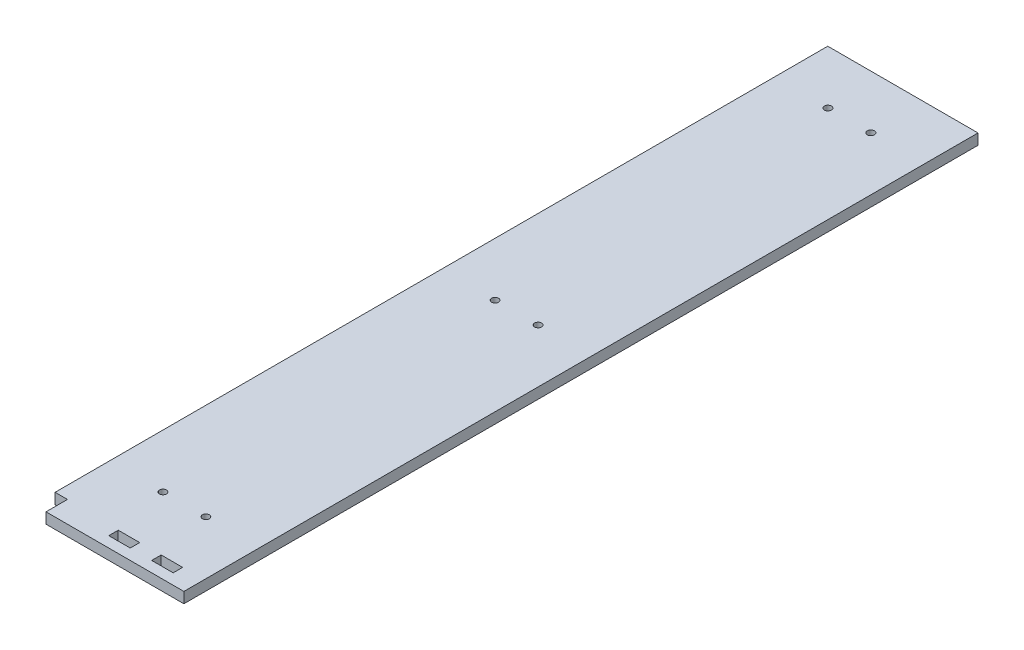
ISO-10303-21;
HEADER;
FILE_DESCRIPTION(('STEP AP214'),'2;1');
FILE_NAME('part.step','',(''),(''),'','','');
FILE_SCHEMA(('AUTOMOTIVE_DESIGN { 1 0 10303 214 1 1 1 1 }'));
ENDSEC;
DATA;
#1=APPLICATION_CONTEXT('core data for automotive mechanical design processes');
#2=APPLICATION_PROTOCOL_DEFINITION('international standard','automotive_design',2000,#1);
#3=PRODUCT_CONTEXT('',#1,'mechanical');
#4=PRODUCT('Part','Part','',(#3));
#5=PRODUCT_RELATED_PRODUCT_CATEGORY('part','',(#4));
#6=PRODUCT_DEFINITION_FORMATION('','',#4);
#7=PRODUCT_DEFINITION_CONTEXT('part definition',#1,'design');
#8=PRODUCT_DEFINITION('design','',#6,#7);
#9=PRODUCT_DEFINITION_SHAPE('','',#8);
#10=(LENGTH_UNIT() NAMED_UNIT(*) SI_UNIT(.MILLI.,.METRE.));
#11=(NAMED_UNIT(*) PLANE_ANGLE_UNIT() SI_UNIT($,.RADIAN.));
#12=(NAMED_UNIT(*) SI_UNIT($,.STERADIAN.) SOLID_ANGLE_UNIT());
#13=UNCERTAINTY_MEASURE_WITH_UNIT(LENGTH_MEASURE(1.E-05),#10,'distance_accuracy_value','');
#14=(GEOMETRIC_REPRESENTATION_CONTEXT(3) GLOBAL_UNCERTAINTY_ASSIGNED_CONTEXT((#13)) GLOBAL_UNIT_ASSIGNED_CONTEXT((#10,
#11,#12)) REPRESENTATION_CONTEXT('',''));
#15=CARTESIAN_POINT('',(0.,0.,0.));
#16=DIRECTION('',(0.,0.,1.));
#17=DIRECTION('',(1.,0.,0.));
#18=AXIS2_PLACEMENT_3D('',#15,#16,#17);
#19=CARTESIAN_POINT('',(0.,0.,0.));
#20=DIRECTION('',(0.,0.,-1.));
#21=DIRECTION('',(-1.,0.,0.));
#22=AXIS2_PLACEMENT_3D('',#19,#20,#21);
#23=PLANE('',#22);
#24=DIRECTION('',(0.,-1.,0.));
#25=VECTOR('',#24,1.);
#26=CARTESIAN_POINT('',(-37.1406515102137,-44.45,0.));
#27=LINE('',#26,#25);
#28=CARTESIAN_POINT('',(-37.1406515102137,-38.1,0.));
#29=VERTEX_POINT('',#28);
#30=CARTESIAN_POINT('',(-37.1406515102137,-44.45,0.));
#31=VERTEX_POINT('',#30);
#32=EDGE_CURVE('E199',#29,#31,#27,.T.);
#33=ORIENTED_EDGE('',*,*,#32,.F.);
#34=DIRECTION('',(-1.,0.,0.));
#35=VECTOR('',#34,1.);
#36=CARTESIAN_POINT('',(44.45,-38.1,0.));
#37=LINE('',#36,#35);
#38=CARTESIAN_POINT('',(-44.45,-38.1,0.));
#39=VERTEX_POINT('',#38);
#40=EDGE_CURVE('E264',#29,#39,#37,.T.);
#41=ORIENTED_EDGE('',*,*,#40,.T.);
#42=DIRECTION('',(0.,-1.,0.));
#43=VECTOR('',#42,1.);
#44=CARTESIAN_POINT('',(-44.45,-38.1,0.));
#45=LINE('',#44,#43);
#46=CARTESIAN_POINT('',(-44.45,-44.45,0.));
#47=VERTEX_POINT('',#46);
#48=EDGE_CURVE('E268',#39,#47,#45,.T.);
#49=ORIENTED_EDGE('',*,*,#48,.T.);
#50=DIRECTION('',(1.,0.,0.));
#51=VECTOR('',#50,1.);
#52=CARTESIAN_POINT('',(44.45,-44.45,0.));
#53=LINE('',#52,#51);
#54=EDGE_CURVE('E219',#47,#31,#53,.T.);
#55=ORIENTED_EDGE('',*,*,#54,.T.);
#56=EDGE_LOOP('',(#33,#41,#49,#55));
#57=FACE_BOUND('',#56,.T.);
#58=ADVANCED_FACE('F33',(#57),#23,.F.);
#59=CARTESIAN_POINT('',(0.,0.,-457.2));
#60=DIRECTION('',(0.,0.,-1.));
#61=DIRECTION('',(-1.,0.,0.));
#62=AXIS2_PLACEMENT_3D('',#59,#60,#61);
#63=PLANE('',#62);
#64=DIRECTION('',(0.,1.,0.));
#65=VECTOR('',#64,1.);
#66=CARTESIAN_POINT('',(44.45,-38.1,-457.2));
#67=LINE('',#66,#65);
#68=CARTESIAN_POINT('',(44.45,-44.45,-457.2));
#69=VERTEX_POINT('',#68);
#70=CARTESIAN_POINT('',(44.45,-38.1,-457.2));
#71=VERTEX_POINT('',#70);
#72=EDGE_CURVE('E42',#69,#71,#67,.T.);
#73=ORIENTED_EDGE('',*,*,#72,.F.);
#74=DIRECTION('',(1.,0.,0.));
#75=VECTOR('',#74,1.);
#76=CARTESIAN_POINT('',(44.45,-44.45,-457.2));
#77=LINE('',#76,#75);
#78=CARTESIAN_POINT('',(-44.45,-44.45,-457.2));
#79=VERTEX_POINT('',#78);
#80=EDGE_CURVE('E282',#79,#69,#77,.T.);
#81=ORIENTED_EDGE('',*,*,#80,.F.);
#82=DIRECTION('',(0.,-1.,0.));
#83=VECTOR('',#82,1.);
#84=CARTESIAN_POINT('',(-44.45,-38.1,-457.2));
#85=LINE('',#84,#83);
#86=CARTESIAN_POINT('',(-44.45,-38.1,-457.2));
#87=VERTEX_POINT('',#86);
#88=EDGE_CURVE('E279',#87,#79,#85,.T.);
#89=ORIENTED_EDGE('',*,*,#88,.F.);
#90=DIRECTION('',(-1.,0.,0.));
#91=VECTOR('',#90,1.);
#92=CARTESIAN_POINT('',(44.45,-38.1,-457.2));
#93=LINE('',#92,#91);
#94=EDGE_CURVE('E273',#71,#87,#93,.T.);
#95=ORIENTED_EDGE('',*,*,#94,.F.);
#96=EDGE_LOOP('',(#73,#81,#89,#95));
#97=FACE_BOUND('',#96,.T.);
#98=ADVANCED_FACE('F35',(#97),#63,.T.);
#99=CARTESIAN_POINT('',(44.45,-38.1,-546.326497182376));
#100=DIRECTION('',(0.,1.,0.));
#101=DIRECTION('',(-1.,0.,0.));
#102=AXIS2_PLACEMENT_3D('',#99,#100,#101);
#103=PLANE('',#102);
#104=DIRECTION('',(0.,0.,-1.));
#105=VECTOR('',#104,1.);
#106=CARTESIAN_POINT('',(6.35000000000004,-38.1,-546.326497182376));
#107=LINE('',#106,#105);
#108=CARTESIAN_POINT('',(6.35000000000004,-38.1,6.35000000000002));
#109=VERTEX_POINT('',#108);
#110=CARTESIAN_POINT('',(6.35000000000004,-38.1,0.743350670350194));
#111=VERTEX_POINT('',#110);
#112=EDGE_CURVE('E168',#109,#111,#107,.T.);
#113=ORIENTED_EDGE('',*,*,#112,.F.);
#114=DIRECTION('',(1.,0.,0.));
#115=VECTOR('',#114,1.);
#116=CARTESIAN_POINT('',(44.45,-38.1,6.34999999999997));
#117=LINE('',#116,#115);
#118=CARTESIAN_POINT('',(-6.34999999999997,-38.1,6.34999999999996));
#119=VERTEX_POINT('',#118);
#120=EDGE_CURVE('E161',#119,#109,#117,.T.);
#121=ORIENTED_EDGE('',*,*,#120,.F.);
#122=DIRECTION('',(0.,0.,1.));
#123=VECTOR('',#122,1.);
#124=CARTESIAN_POINT('',(-6.34999999999997,-38.1,-546.326497182376));
#125=LINE('',#124,#123);
#126=CARTESIAN_POINT('',(-6.34999999999996,-38.1,0.743350670350193));
#127=VERTEX_POINT('',#126);
#128=EDGE_CURVE('E141',#127,#119,#125,.T.);
#129=ORIENTED_EDGE('',*,*,#128,.F.);
#130=DIRECTION('',(-1.,0.,0.));
#131=VECTOR('',#130,1.);
#132=CARTESIAN_POINT('',(44.45,-38.1,0.74335067035014));
#133=LINE('',#132,#131);
#134=EDGE_CURVE('E166',#111,#127,#133,.T.);
#135=ORIENTED_EDGE('',*,*,#134,.F.);
#136=EDGE_LOOP('',(#113,#121,#129,#135));
#137=FACE_BOUND('',#136,.T.);
#138=DIRECTION('',(0.,0.,-1.));
#139=VECTOR('',#138,1.);
#140=CARTESIAN_POINT('',(31.75,-38.1,-546.326497182376));
#141=LINE('',#140,#139);
#142=CARTESIAN_POINT('',(31.75,-38.1,6.35000000000002));
#143=VERTEX_POINT('',#142);
#144=CARTESIAN_POINT('',(31.75,-38.1,0.743350670350198));
#145=VERTEX_POINT('',#144);
#146=EDGE_CURVE('E197',#143,#145,#141,.T.);
#147=ORIENTED_EDGE('',*,*,#146,.F.);
#148=DIRECTION('',(1.,0.,0.));
#149=VECTOR('',#148,1.);
#150=CARTESIAN_POINT('',(44.45,-38.1,6.35000000000008));
#151=LINE('',#150,#149);
#152=CARTESIAN_POINT('',(19.05,-38.1,6.35000000000008));
#153=VERTEX_POINT('',#152);
#154=EDGE_CURVE('E184',#153,#143,#151,.T.);
#155=ORIENTED_EDGE('',*,*,#154,.F.);
#156=DIRECTION('',(0.,0.,1.));
#157=VECTOR('',#156,1.);
#158=CARTESIAN_POINT('',(19.05,-38.1,-546.326497182376));
#159=LINE('',#158,#157);
#160=CARTESIAN_POINT('',(19.05,-38.1,0.743350670350197));
#161=VERTEX_POINT('',#160);
#162=EDGE_CURVE('E192',#161,#153,#159,.T.);
#163=ORIENTED_EDGE('',*,*,#162,.F.);
#164=DIRECTION('',(-1.,0.,0.));
#165=VECTOR('',#164,1.);
#166=CARTESIAN_POINT('',(44.45,-38.1,0.743350670350251));
#167=LINE('',#166,#165);
#168=EDGE_CURVE('E195',#145,#161,#167,.T.);
#169=ORIENTED_EDGE('',*,*,#168,.F.);
#170=EDGE_LOOP('',(#147,#155,#163,#169));
#171=FACE_BOUND('',#170,.T.);
#172=CARTESIAN_POINT('',(12.7,-38.1,-425.5516));
#173=DIRECTION('',(0.,-1.,0.));
#174=DIRECTION('',(1.,0.,0.));
#175=AXIS2_PLACEMENT_3D('',#172,#173,#174);
#176=CIRCLE('',#175,2.09549999999999);
#177=CARTESIAN_POINT('',(14.7954999999999,-38.1,-425.5516));
#178=VERTEX_POINT('',#177);
#179=EDGE_CURVE('E213',#178,#178,#176,.T.);
#180=ORIENTED_EDGE('',*,*,#179,.T.);
#181=EDGE_LOOP('',(#180));
#182=FACE_BOUND('',#181,.T.);
#183=CARTESIAN_POINT('',(-12.7000000000001,-38.1,-425.5516));
#184=DIRECTION('',(0.,-1.,0.));
#185=DIRECTION('',(1.,0.,0.));
#186=AXIS2_PLACEMENT_3D('',#183,#184,#185);
#187=CIRCLE('',#186,2.09549999999998);
#188=CARTESIAN_POINT('',(-10.6045000000001,-38.1,-425.5516));
#189=VERTEX_POINT('',#188);
#190=EDGE_CURVE('E237',#189,#189,#187,.T.);
#191=ORIENTED_EDGE('',*,*,#190,.T.);
#192=EDGE_LOOP('',(#191));
#193=FACE_BOUND('',#192,.T.);
#194=CARTESIAN_POINT('',(12.7,-38.1,-32.0675));
#195=DIRECTION('',(0.,-1.,0.));
#196=DIRECTION('',(1.,0.,0.));
#197=AXIS2_PLACEMENT_3D('',#194,#195,#196);
#198=CIRCLE('',#197,2.06375);
#199=CARTESIAN_POINT('',(14.76375,-38.1,-32.0675));
#200=VERTEX_POINT('',#199);
#201=EDGE_CURVE('E243',#200,#200,#198,.T.);
#202=ORIENTED_EDGE('',*,*,#201,.T.);
#203=EDGE_LOOP('',(#202));
#204=FACE_BOUND('',#203,.T.);
#205=CARTESIAN_POINT('',(-12.7,-38.1,-32.0675));
#206=DIRECTION('',(0.,-1.,0.));
#207=DIRECTION('',(1.,0.,0.));
#208=AXIS2_PLACEMENT_3D('',#205,#206,#207);
#209=CIRCLE('',#208,2.06375);
#210=CARTESIAN_POINT('',(-10.63625,-38.1,-32.0675));
#211=VERTEX_POINT('',#210);
#212=EDGE_CURVE('E249',#211,#211,#209,.T.);
#213=ORIENTED_EDGE('',*,*,#212,.T.);
#214=EDGE_LOOP('',(#213));
#215=FACE_BOUND('',#214,.T.);
#216=CARTESIAN_POINT('',(12.7,-38.1,-228.6));
#217=DIRECTION('',(0.,-1.,0.));
#218=DIRECTION('',(1.,0.,0.));
#219=AXIS2_PLACEMENT_3D('',#216,#217,#218);
#220=CIRCLE('',#219,2.06375);
#221=CARTESIAN_POINT('',(14.76375,-38.1,-228.6));
#222=VERTEX_POINT('',#221);
#223=EDGE_CURVE('E255',#222,#222,#220,.T.);
#224=ORIENTED_EDGE('',*,*,#223,.T.);
#225=EDGE_LOOP('',(#224));
#226=FACE_BOUND('',#225,.T.);
#227=CARTESIAN_POINT('',(-12.7,-38.1,-228.6));
#228=DIRECTION('',(0.,-1.,0.));
#229=DIRECTION('',(1.,0.,0.));
#230=AXIS2_PLACEMENT_3D('',#227,#228,#229);
#231=CIRCLE('',#230,2.06375);
#232=CARTESIAN_POINT('',(-10.63625,-38.1,-228.6));
#233=VERTEX_POINT('',#232);
#234=EDGE_CURVE('E261',#233,#233,#231,.T.);
#235=ORIENTED_EDGE('',*,*,#234,.T.);
#236=EDGE_LOOP('',(#235));
#237=FACE_BOUND('',#236,.T.);
#238=DIRECTION('',(0.,0.,1.));
#239=VECTOR('',#238,1.);
#240=CARTESIAN_POINT('',(44.45,-38.1,-546.326497182376));
#241=LINE('',#240,#239);
#242=CARTESIAN_POINT('',(44.45,-38.1,12.7));
#243=VERTEX_POINT('',#242);
#244=EDGE_CURVE('E11',#71,#243,#241,.T.);
#245=ORIENTED_EDGE('',*,*,#244,.F.);
#246=ORIENTED_EDGE('',*,*,#94,.T.);
#247=DIRECTION('',(0.,0.,1.));
#248=VECTOR('',#247,1.);
#249=CARTESIAN_POINT('',(-44.45,-38.1,-546.326497182376));
#250=LINE('',#249,#248);
#251=EDGE_CURVE('E276',#87,#39,#250,.T.);
#252=ORIENTED_EDGE('',*,*,#251,.T.);
#253=ORIENTED_EDGE('',*,*,#40,.F.);
#254=DIRECTION('',(0.,0.,-1.));
#255=VECTOR('',#254,1.);
#256=CARTESIAN_POINT('',(-37.1406515102137,-38.1,12.7));
#257=LINE('',#256,#255);
#258=CARTESIAN_POINT('',(-37.1406515102137,-38.1,12.7));
#259=VERTEX_POINT('',#258);
#260=EDGE_CURVE('E224',#259,#29,#257,.T.);
#261=ORIENTED_EDGE('',*,*,#260,.F.);
#262=DIRECTION('',(-1.,0.,0.));
#263=VECTOR('',#262,1.);
#264=CARTESIAN_POINT('',(44.45,-38.1,12.7));
#265=LINE('',#264,#263);
#266=EDGE_CURVE('E203',#243,#259,#265,.T.);
#267=ORIENTED_EDGE('',*,*,#266,.F.);
#268=EDGE_LOOP('',(#245,#246,#252,#253,#261,#267));
#269=FACE_BOUND('',#268,.T.);
#270=ADVANCED_FACE('F298',(#137,#171,#182,#193,#204,#215,#226,#237,#269),#103,.T.);
#271=CARTESIAN_POINT('',(-44.45,-38.1,-546.326497182376));
#272=DIRECTION('',(-1.,0.,0.));
#273=DIRECTION('',(0.,0.,1.));
#274=AXIS2_PLACEMENT_3D('',#271,#272,#273);
#275=PLANE('',#274);
#276=ORIENTED_EDGE('',*,*,#251,.F.);
#277=ORIENTED_EDGE('',*,*,#88,.T.);
#278=DIRECTION('',(0.,0.,1.));
#279=VECTOR('',#278,1.);
#280=CARTESIAN_POINT('',(-44.45,-44.45,-546.326497182376));
#281=LINE('',#280,#279);
#282=EDGE_CURVE('E280',#79,#47,#281,.T.);
#283=ORIENTED_EDGE('',*,*,#282,.T.);
#284=ORIENTED_EDGE('',*,*,#48,.F.);
#285=EDGE_LOOP('',(#276,#277,#283,#284));
#286=FACE_BOUND('',#285,.T.);
#287=ADVANCED_FACE('F310',(#286),#275,.T.);
#288=CARTESIAN_POINT('',(44.45,-44.45,-546.326497182376));
#289=DIRECTION('',(0.,-1.,0.));
#290=DIRECTION('',(1.,0.,0.));
#291=AXIS2_PLACEMENT_3D('',#288,#289,#290);
#292=PLANE('',#291);
#293=DIRECTION('',(0.,0.,1.));
#294=VECTOR('',#293,1.);
#295=CARTESIAN_POINT('',(6.35000000000004,-44.45,0.743350670350194));
#296=LINE('',#295,#294);
#297=CARTESIAN_POINT('',(6.35000000000004,-44.45,0.743350670350194));
#298=VERTEX_POINT('',#297);
#299=CARTESIAN_POINT('',(6.35000000000004,-44.45,6.34999999999996));
#300=VERTEX_POINT('',#299);
#301=EDGE_CURVE('E58',#298,#300,#296,.T.);
#302=ORIENTED_EDGE('',*,*,#301,.F.);
#303=DIRECTION('',(1.,0.,0.));
#304=VECTOR('',#303,1.);
#305=CARTESIAN_POINT('',(6.35000000000004,-44.45,0.743350670350194));
#306=LINE('',#305,#304);
#307=CARTESIAN_POINT('',(-6.34999999999996,-44.45,0.743350670350193));
#308=VERTEX_POINT('',#307);
#309=EDGE_CURVE('E154',#308,#298,#306,.T.);
#310=ORIENTED_EDGE('',*,*,#309,.F.);
#311=DIRECTION('',(0.,0.,-1.));
#312=VECTOR('',#311,1.);
#313=CARTESIAN_POINT('',(-6.34999999999996,-44.45,0.743350670350193));
#314=LINE('',#313,#312);
#315=CARTESIAN_POINT('',(-6.34999999999996,-44.45,6.35000000000002));
#316=VERTEX_POINT('',#315);
#317=EDGE_CURVE('E138',#316,#308,#314,.T.);
#318=ORIENTED_EDGE('',*,*,#317,.F.);
#319=DIRECTION('',(-1.,0.,0.));
#320=VECTOR('',#319,1.);
#321=CARTESIAN_POINT('',(6.35000000000004,-44.45,6.35000000000002));
#322=LINE('',#321,#320);
#323=EDGE_CURVE('E147',#300,#316,#322,.T.);
#324=ORIENTED_EDGE('',*,*,#323,.F.);
#325=EDGE_LOOP('',(#302,#310,#318,#324));
#326=FACE_BOUND('',#325,.T.);
#327=DIRECTION('',(0.,0.,1.));
#328=VECTOR('',#327,1.);
#329=CARTESIAN_POINT('',(31.75,-44.45,0.743350670350198));
#330=LINE('',#329,#328);
#331=CARTESIAN_POINT('',(31.75,-44.45,0.743350670350198));
#332=VERTEX_POINT('',#331);
#333=CARTESIAN_POINT('',(31.75,-44.45,6.35000000000008));
#334=VERTEX_POINT('',#333);
#335=EDGE_CURVE('E170',#332,#334,#330,.T.);
#336=ORIENTED_EDGE('',*,*,#335,.F.);
#337=DIRECTION('',(1.,0.,0.));
#338=VECTOR('',#337,1.);
#339=CARTESIAN_POINT('',(31.75,-44.45,0.743350670350198));
#340=LINE('',#339,#338);
#341=CARTESIAN_POINT('',(19.05,-44.45,0.743350670350197));
#342=VERTEX_POINT('',#341);
#343=EDGE_CURVE('E178',#342,#332,#340,.T.);
#344=ORIENTED_EDGE('',*,*,#343,.F.);
#345=DIRECTION('',(0.,0.,-1.));
#346=VECTOR('',#345,1.);
#347=CARTESIAN_POINT('',(19.05,-44.45,0.743350670350197));
#348=LINE('',#347,#346);
#349=CARTESIAN_POINT('',(19.05,-44.45,6.35000000000002));
#350=VERTEX_POINT('',#349);
#351=EDGE_CURVE('E175',#350,#342,#348,.T.);
#352=ORIENTED_EDGE('',*,*,#351,.F.);
#353=DIRECTION('',(-1.,0.,0.));
#354=VECTOR('',#353,1.);
#355=CARTESIAN_POINT('',(31.75,-44.45,6.35000000000002));
#356=LINE('',#355,#354);
#357=EDGE_CURVE('E172',#334,#350,#356,.T.);
#358=ORIENTED_EDGE('',*,*,#357,.F.);
#359=EDGE_LOOP('',(#336,#344,#352,#358));
#360=FACE_BOUND('',#359,.T.);
#361=CARTESIAN_POINT('',(12.7,-44.45,-425.5516));
#362=DIRECTION('',(0.,-1.,0.));
#363=DIRECTION('',(1.,0.,0.));
#364=AXIS2_PLACEMENT_3D('',#361,#362,#363);
#365=CIRCLE('',#364,2.09549999999999);
#366=CARTESIAN_POINT('',(14.7954999999999,-44.45,-425.5516));
#367=VERTEX_POINT('',#366);
#368=EDGE_CURVE('E227',#367,#367,#365,.T.);
#369=ORIENTED_EDGE('',*,*,#368,.F.);
#370=EDGE_LOOP('',(#369));
#371=FACE_BOUND('',#370,.T.);
#372=CARTESIAN_POINT('',(-12.7000000000001,-44.45,-425.5516));
#373=DIRECTION('',(0.,-1.,0.));
#374=DIRECTION('',(1.,0.,0.));
#375=AXIS2_PLACEMENT_3D('',#372,#373,#374);
#376=CIRCLE('',#375,2.09549999999998);
#377=CARTESIAN_POINT('',(-10.6045000000001,-44.45,-425.5516));
#378=VERTEX_POINT('',#377);
#379=EDGE_CURVE('E235',#378,#378,#376,.T.);
#380=ORIENTED_EDGE('',*,*,#379,.F.);
#381=EDGE_LOOP('',(#380));
#382=FACE_BOUND('',#381,.T.);
#383=CARTESIAN_POINT('',(12.7,-44.45,-32.0675));
#384=DIRECTION('',(0.,-1.,0.));
#385=DIRECTION('',(1.,0.,0.));
#386=AXIS2_PLACEMENT_3D('',#383,#384,#385);
#387=CIRCLE('',#386,2.06375);
#388=CARTESIAN_POINT('',(14.76375,-44.45,-32.0675));
#389=VERTEX_POINT('',#388);
#390=EDGE_CURVE('E240',#389,#389,#387,.T.);
#391=ORIENTED_EDGE('',*,*,#390,.F.);
#392=EDGE_LOOP('',(#391));
#393=FACE_BOUND('',#392,.T.);
#394=CARTESIAN_POINT('',(-12.7,-44.45,-32.0675));
#395=DIRECTION('',(0.,-1.,0.));
#396=DIRECTION('',(1.,0.,0.));
#397=AXIS2_PLACEMENT_3D('',#394,#395,#396);
#398=CIRCLE('',#397,2.06375);
#399=CARTESIAN_POINT('',(-10.63625,-44.45,-32.0675));
#400=VERTEX_POINT('',#399);
#401=EDGE_CURVE('E246',#400,#400,#398,.T.);
#402=ORIENTED_EDGE('',*,*,#401,.F.);
#403=EDGE_LOOP('',(#402));
#404=FACE_BOUND('',#403,.T.);
#405=CARTESIAN_POINT('',(12.7,-44.45,-228.6));
#406=DIRECTION('',(0.,-1.,0.));
#407=DIRECTION('',(1.,0.,0.));
#408=AXIS2_PLACEMENT_3D('',#405,#406,#407);
#409=CIRCLE('',#408,2.06375);
#410=CARTESIAN_POINT('',(14.76375,-44.45,-228.6));
#411=VERTEX_POINT('',#410);
#412=EDGE_CURVE('E252',#411,#411,#409,.T.);
#413=ORIENTED_EDGE('',*,*,#412,.F.);
#414=EDGE_LOOP('',(#413));
#415=FACE_BOUND('',#414,.T.);
#416=CARTESIAN_POINT('',(-12.7,-44.45,-228.6));
#417=DIRECTION('',(0.,-1.,0.));
#418=DIRECTION('',(1.,0.,0.));
#419=AXIS2_PLACEMENT_3D('',#416,#417,#418);
#420=CIRCLE('',#419,2.06375);
#421=CARTESIAN_POINT('',(-10.63625,-44.45,-228.6));
#422=VERTEX_POINT('',#421);
#423=EDGE_CURVE('E258',#422,#422,#420,.T.);
#424=ORIENTED_EDGE('',*,*,#423,.F.);
#425=EDGE_LOOP('',(#424));
#426=FACE_BOUND('',#425,.T.);
#427=ORIENTED_EDGE('',*,*,#282,.F.);
#428=ORIENTED_EDGE('',*,*,#80,.T.);
#429=DIRECTION('',(0.,0.,1.));
#430=VECTOR('',#429,1.);
#431=CARTESIAN_POINT('',(44.45,-44.45,-546.326497182376));
#432=LINE('',#431,#430);
#433=CARTESIAN_POINT('',(44.45,-44.45,12.7));
#434=VERTEX_POINT('',#433);
#435=EDGE_CURVE('E283',#69,#434,#432,.T.);
#436=ORIENTED_EDGE('',*,*,#435,.T.);
#437=DIRECTION('',(1.,0.,0.));
#438=VECTOR('',#437,1.);
#439=CARTESIAN_POINT('',(44.45,-44.45,12.7));
#440=LINE('',#439,#438);
#441=CARTESIAN_POINT('',(-37.1406515102137,-44.45,12.7));
#442=VERTEX_POINT('',#441);
#443=EDGE_CURVE('E207',#442,#434,#440,.T.);
#444=ORIENTED_EDGE('',*,*,#443,.F.);
#445=DIRECTION('',(0.,0.,-1.));
#446=VECTOR('',#445,1.);
#447=CARTESIAN_POINT('',(-37.1406515102137,-44.45,12.7));
#448=LINE('',#447,#446);
#449=EDGE_CURVE('E210',#442,#31,#448,.T.);
#450=ORIENTED_EDGE('',*,*,#449,.T.);
#451=ORIENTED_EDGE('',*,*,#54,.F.);
#452=EDGE_LOOP('',(#427,#428,#436,#444,#450,#451));
#453=FACE_BOUND('',#452,.T.);
#454=ADVANCED_FACE('F151',(#326,#360,#371,#382,#393,#404,#415,#426,#453),#292,.T.);
#455=CARTESIAN_POINT('',(44.45,-38.1,-546.326497182376));
#456=DIRECTION('',(1.,0.,0.));
#457=DIRECTION('',(0.,0.,-1.));
#458=AXIS2_PLACEMENT_3D('',#455,#456,#457);
#459=PLANE('',#458);
#460=ORIENTED_EDGE('',*,*,#435,.F.);
#461=ORIENTED_EDGE('',*,*,#72,.T.);
#462=ORIENTED_EDGE('',*,*,#244,.T.);
#463=DIRECTION('',(0.,1.,0.));
#464=VECTOR('',#463,1.);
#465=CARTESIAN_POINT('',(44.45,-44.45,12.7));
#466=LINE('',#465,#464);
#467=EDGE_CURVE('E200',#434,#243,#466,.T.);
#468=ORIENTED_EDGE('',*,*,#467,.F.);
#469=EDGE_LOOP('',(#460,#461,#462,#468));
#470=FACE_BOUND('',#469,.T.);
#471=ADVANCED_FACE('F292',(#470),#459,.T.);
#472=CARTESIAN_POINT('',(-12.7,-38.1,-228.6));
#473=DIRECTION('',(0.,-1.,0.));
#474=DIRECTION('',(1.,0.,0.));
#475=AXIS2_PLACEMENT_3D('',#472,#473,#474);
#476=CYLINDRICAL_SURFACE('',#475,2.06375);
#477=ORIENTED_EDGE('',*,*,#234,.F.);
#478=EDGE_LOOP('',(#477));
#479=FACE_BOUND('',#478,.T.);
#480=ORIENTED_EDGE('',*,*,#423,.T.);
#481=EDGE_LOOP('',(#480));
#482=FACE_BOUND('',#481,.T.);
#483=ADVANCED_FACE('F332',(#479,#482),#476,.F.);
#484=CARTESIAN_POINT('',(12.7,-38.1,-228.6));
#485=DIRECTION('',(0.,-1.,0.));
#486=DIRECTION('',(1.,0.,0.));
#487=AXIS2_PLACEMENT_3D('',#484,#485,#486);
#488=CYLINDRICAL_SURFACE('',#487,2.06375);
#489=ORIENTED_EDGE('',*,*,#223,.F.);
#490=EDGE_LOOP('',(#489));
#491=FACE_BOUND('',#490,.T.);
#492=ORIENTED_EDGE('',*,*,#412,.T.);
#493=EDGE_LOOP('',(#492));
#494=FACE_BOUND('',#493,.T.);
#495=ADVANCED_FACE('F364',(#491,#494),#488,.F.);
#496=CARTESIAN_POINT('',(-12.7,-38.1,-32.0675));
#497=DIRECTION('',(0.,-1.,0.));
#498=DIRECTION('',(1.,0.,0.));
#499=AXIS2_PLACEMENT_3D('',#496,#497,#498);
#500=CYLINDRICAL_SURFACE('',#499,2.06375);
#501=ORIENTED_EDGE('',*,*,#212,.F.);
#502=EDGE_LOOP('',(#501));
#503=FACE_BOUND('',#502,.T.);
#504=ORIENTED_EDGE('',*,*,#401,.T.);
#505=EDGE_LOOP('',(#504));
#506=FACE_BOUND('',#505,.T.);
#507=ADVANCED_FACE('F370',(#503,#506),#500,.F.);
#508=CARTESIAN_POINT('',(12.7,-38.1,-32.0675));
#509=DIRECTION('',(0.,-1.,0.));
#510=DIRECTION('',(1.,0.,0.));
#511=AXIS2_PLACEMENT_3D('',#508,#509,#510);
#512=CYLINDRICAL_SURFACE('',#511,2.06375);
#513=ORIENTED_EDGE('',*,*,#201,.F.);
#514=EDGE_LOOP('',(#513));
#515=FACE_BOUND('',#514,.T.);
#516=ORIENTED_EDGE('',*,*,#390,.T.);
#517=EDGE_LOOP('',(#516));
#518=FACE_BOUND('',#517,.T.);
#519=ADVANCED_FACE('F375',(#515,#518),#512,.F.);
#520=CARTESIAN_POINT('',(-12.7000000000001,-38.1,-425.5516));
#521=DIRECTION('',(0.,-1.,0.));
#522=DIRECTION('',(1.,0.,0.));
#523=AXIS2_PLACEMENT_3D('',#520,#521,#522);
#524=CYLINDRICAL_SURFACE('',#523,2.09549999999998);
#525=ORIENTED_EDGE('',*,*,#190,.F.);
#526=EDGE_LOOP('',(#525));
#527=FACE_BOUND('',#526,.T.);
#528=ORIENTED_EDGE('',*,*,#379,.T.);
#529=EDGE_LOOP('',(#528));
#530=FACE_BOUND('',#529,.T.);
#531=ADVANCED_FACE('F322',(#527,#530),#524,.F.);
#532=CARTESIAN_POINT('',(12.7,-38.1,-425.5516));
#533=DIRECTION('',(0.,-1.,0.));
#534=DIRECTION('',(1.,0.,0.));
#535=AXIS2_PLACEMENT_3D('',#532,#533,#534);
#536=CYLINDRICAL_SURFACE('',#535,2.09549999999999);
#537=ORIENTED_EDGE('',*,*,#179,.F.);
#538=EDGE_LOOP('',(#537));
#539=FACE_BOUND('',#538,.T.);
#540=ORIENTED_EDGE('',*,*,#368,.T.);
#541=EDGE_LOOP('',(#540));
#542=FACE_BOUND('',#541,.T.);
#543=ADVANCED_FACE('F314',(#539,#542),#536,.F.);
#544=CARTESIAN_POINT('',(-37.1406515102137,-44.45,12.7));
#545=DIRECTION('',(1.,0.,0.));
#546=DIRECTION('',(0.,0.,-1.));
#547=AXIS2_PLACEMENT_3D('',#544,#545,#546);
#548=PLANE('',#547);
#549=ORIENTED_EDGE('',*,*,#32,.T.);
#550=ORIENTED_EDGE('',*,*,#449,.F.);
#551=DIRECTION('',(0.,-1.,0.));
#552=VECTOR('',#551,1.);
#553=CARTESIAN_POINT('',(-37.1406515102137,-44.45,12.7));
#554=LINE('',#553,#552);
#555=EDGE_CURVE('E205',#259,#442,#554,.T.);
#556=ORIENTED_EDGE('',*,*,#555,.F.);
#557=ORIENTED_EDGE('',*,*,#260,.T.);
#558=EDGE_LOOP('',(#549,#550,#556,#557));
#559=FACE_BOUND('',#558,.T.);
#560=ADVANCED_FACE('F312',(#559),#548,.F.);
#561=CARTESIAN_POINT('',(0.,0.,12.7));
#562=DIRECTION('',(0.,0.,1.));
#563=DIRECTION('',(1.,0.,0.));
#564=AXIS2_PLACEMENT_3D('',#561,#562,#563);
#565=PLANE('',#564);
#566=ORIENTED_EDGE('',*,*,#467,.T.);
#567=ORIENTED_EDGE('',*,*,#266,.T.);
#568=ORIENTED_EDGE('',*,*,#555,.T.);
#569=ORIENTED_EDGE('',*,*,#443,.T.);
#570=EDGE_LOOP('',(#566,#567,#568,#569));
#571=FACE_BOUND('',#570,.T.);
#572=ADVANCED_FACE('F301',(#571),#565,.T.);
#573=CARTESIAN_POINT('',(31.75,-31.75,0.743350670350198));
#574=DIRECTION('',(1.,0.,0.));
#575=DIRECTION('',(0.,1.,0.));
#576=AXIS2_PLACEMENT_3D('',#573,#574,#575);
#577=PLANE('',#576);
#578=ORIENTED_EDGE('',*,*,#146,.T.);
#579=DIRECTION('',(0.,-1.,0.));
#580=VECTOR('',#579,1.);
#581=CARTESIAN_POINT('',(31.75,-31.75,0.743350670350198));
#582=LINE('',#581,#580);
#583=EDGE_CURVE('E182',#145,#332,#582,.T.);
#584=ORIENTED_EDGE('',*,*,#583,.T.);
#585=ORIENTED_EDGE('',*,*,#335,.T.);
#586=DIRECTION('',(0.,-1.,0.));
#587=VECTOR('',#586,1.);
#588=CARTESIAN_POINT('',(31.75,-31.75,6.35000000000002));
#589=LINE('',#588,#587);
#590=EDGE_CURVE('E181',#143,#334,#589,.T.);
#591=ORIENTED_EDGE('',*,*,#590,.F.);
#592=EDGE_LOOP('',(#578,#584,#585,#591));
#593=FACE_BOUND('',#592,.T.);
#594=ADVANCED_FACE('F320',(#593),#577,.F.);
#595=CARTESIAN_POINT('',(31.75,-31.75,0.743350670350198));
#596=DIRECTION('',(0.,0.,-1.));
#597=DIRECTION('',(-1.,0.,0.));
#598=AXIS2_PLACEMENT_3D('',#595,#596,#597);
#599=PLANE('',#598);
#600=ORIENTED_EDGE('',*,*,#168,.T.);
#601=DIRECTION('',(0.,-1.,0.));
#602=VECTOR('',#601,1.);
#603=CARTESIAN_POINT('',(19.05,-31.75,0.743350670350197));
#604=LINE('',#603,#602);
#605=EDGE_CURVE('E185',#161,#342,#604,.T.);
#606=ORIENTED_EDGE('',*,*,#605,.T.);
#607=ORIENTED_EDGE('',*,*,#343,.T.);
#608=ORIENTED_EDGE('',*,*,#583,.F.);
#609=EDGE_LOOP('',(#600,#606,#607,#608));
#610=FACE_BOUND('',#609,.T.);
#611=ADVANCED_FACE('F446',(#610),#599,.F.);
#612=CARTESIAN_POINT('',(19.05,-31.75,0.743350670350197));
#613=DIRECTION('',(-1.,0.,0.));
#614=DIRECTION('',(0.,-1.,0.));
#615=AXIS2_PLACEMENT_3D('',#612,#613,#614);
#616=PLANE('',#615);
#617=ORIENTED_EDGE('',*,*,#162,.T.);
#618=DIRECTION('',(0.,-1.,0.));
#619=VECTOR('',#618,1.);
#620=CARTESIAN_POINT('',(19.05,-31.75,6.35000000000002));
#621=LINE('',#620,#619);
#622=EDGE_CURVE('E187',#153,#350,#621,.T.);
#623=ORIENTED_EDGE('',*,*,#622,.T.);
#624=ORIENTED_EDGE('',*,*,#351,.T.);
#625=ORIENTED_EDGE('',*,*,#605,.F.);
#626=EDGE_LOOP('',(#617,#623,#624,#625));
#627=FACE_BOUND('',#626,.T.);
#628=ADVANCED_FACE('F456',(#627),#616,.F.);
#629=CARTESIAN_POINT('',(31.75,-31.75,6.35000000000002));
#630=DIRECTION('',(0.,0.,1.));
#631=DIRECTION('',(1.,0.,0.));
#632=AXIS2_PLACEMENT_3D('',#629,#630,#631);
#633=PLANE('',#632);
#634=ORIENTED_EDGE('',*,*,#154,.T.);
#635=ORIENTED_EDGE('',*,*,#590,.T.);
#636=ORIENTED_EDGE('',*,*,#357,.T.);
#637=ORIENTED_EDGE('',*,*,#622,.F.);
#638=EDGE_LOOP('',(#634,#635,#636,#637));
#639=FACE_BOUND('',#638,.T.);
#640=ADVANCED_FACE('F466',(#639),#633,.F.);
#641=CARTESIAN_POINT('',(6.35000000000003,-31.75,0.743350670350194));
#642=DIRECTION('',(1.,0.,0.));
#643=DIRECTION('',(0.,1.,0.));
#644=AXIS2_PLACEMENT_3D('',#641,#642,#643);
#645=PLANE('',#644);
#646=ORIENTED_EDGE('',*,*,#112,.T.);
#647=DIRECTION('',(0.,-1.,0.));
#648=VECTOR('',#647,1.);
#649=CARTESIAN_POINT('',(6.35000000000003,-31.75,0.743350670350194));
#650=LINE('',#649,#648);
#651=EDGE_CURVE('E159',#111,#298,#650,.T.);
#652=ORIENTED_EDGE('',*,*,#651,.T.);
#653=ORIENTED_EDGE('',*,*,#301,.T.);
#654=DIRECTION('',(0.,-1.,0.));
#655=VECTOR('',#654,1.);
#656=CARTESIAN_POINT('',(6.35000000000003,-31.75,6.35000000000002));
#657=LINE('',#656,#655);
#658=EDGE_CURVE('E144',#109,#300,#657,.T.);
#659=ORIENTED_EDGE('',*,*,#658,.F.);
#660=EDGE_LOOP('',(#646,#652,#653,#659));
#661=FACE_BOUND('',#660,.T.);
#662=ADVANCED_FACE('F476',(#661),#645,.F.);
#663=CARTESIAN_POINT('',(6.35000000000003,-31.75,0.743350670350194));
#664=DIRECTION('',(0.,0.,-1.));
#665=DIRECTION('',(-1.,0.,0.));
#666=AXIS2_PLACEMENT_3D('',#663,#664,#665);
#667=PLANE('',#666);
#668=ORIENTED_EDGE('',*,*,#134,.T.);
#669=DIRECTION('',(0.,-1.,0.));
#670=VECTOR('',#669,1.);
#671=CARTESIAN_POINT('',(-6.34999999999997,-31.75,0.743350670350193));
#672=LINE('',#671,#670);
#673=EDGE_CURVE('E143',#127,#308,#672,.T.);
#674=ORIENTED_EDGE('',*,*,#673,.T.);
#675=ORIENTED_EDGE('',*,*,#309,.T.);
#676=ORIENTED_EDGE('',*,*,#651,.F.);
#677=EDGE_LOOP('',(#668,#674,#675,#676));
#678=FACE_BOUND('',#677,.T.);
#679=ADVANCED_FACE('F486',(#678),#667,.F.);
#680=CARTESIAN_POINT('',(-6.34999999999997,-31.75,0.743350670350193));
#681=DIRECTION('',(-1.,0.,0.));
#682=DIRECTION('',(0.,-1.,0.));
#683=AXIS2_PLACEMENT_3D('',#680,#681,#682);
#684=PLANE('',#683);
#685=ORIENTED_EDGE('',*,*,#128,.T.);
#686=DIRECTION('',(0.,-1.,0.));
#687=VECTOR('',#686,1.);
#688=CARTESIAN_POINT('',(-6.34999999999997,-31.75,6.35000000000002));
#689=LINE('',#688,#687);
#690=EDGE_CURVE('E50',#119,#316,#689,.T.);
#691=ORIENTED_EDGE('',*,*,#690,.T.);
#692=ORIENTED_EDGE('',*,*,#317,.T.);
#693=ORIENTED_EDGE('',*,*,#673,.F.);
#694=EDGE_LOOP('',(#685,#691,#692,#693));
#695=FACE_BOUND('',#694,.T.);
#696=ADVANCED_FACE('F135',(#695),#684,.F.);
#697=CARTESIAN_POINT('',(6.35000000000003,-31.75,6.35000000000002));
#698=DIRECTION('',(0.,0.,1.));
#699=DIRECTION('',(1.,0.,0.));
#700=AXIS2_PLACEMENT_3D('',#697,#698,#699);
#701=PLANE('',#700);
#702=ORIENTED_EDGE('',*,*,#120,.T.);
#703=ORIENTED_EDGE('',*,*,#658,.T.);
#704=ORIENTED_EDGE('',*,*,#323,.T.);
#705=ORIENTED_EDGE('',*,*,#690,.F.);
#706=EDGE_LOOP('',(#702,#703,#704,#705));
#707=FACE_BOUND('',#706,.T.);
#708=ADVANCED_FACE('F148',(#707),#701,.F.);
#709=CLOSED_SHELL('',(#58,#98,#270,#287,#454,#471,#483,#495,#507,#519,#531,#543,#560,#572,#594,
#611,#628,#640,#662,#679,#696,#708));
#710=MANIFOLD_SOLID_BREP('B2',#709);
#711=ADVANCED_BREP_SHAPE_REPRESENTATION('',(#18,#710),#14);
#712=SHAPE_DEFINITION_REPRESENTATION(#9,#711);
ENDSEC;
END-ISO-10303-21;
